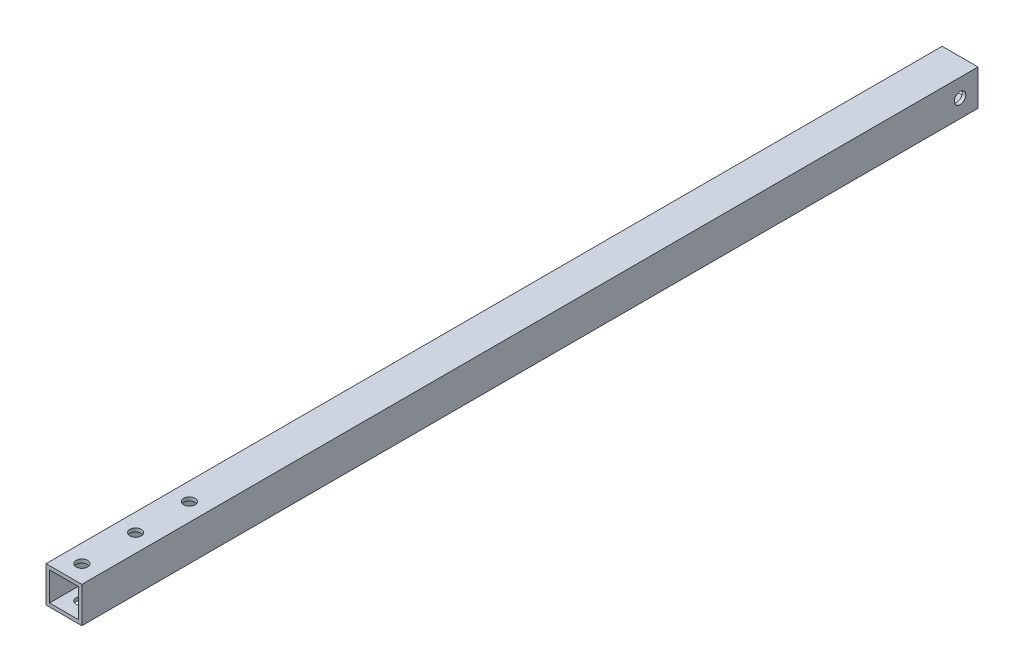
ISO-10303-21;
HEADER;
FILE_DESCRIPTION(('STEP AP214'),'2;1');
FILE_NAME('part.step','',(''),(''),'','','');
FILE_SCHEMA(('AUTOMOTIVE_DESIGN { 1 0 10303 214 1 1 1 1 }'));
ENDSEC;
DATA;
#1=APPLICATION_CONTEXT('core data for automotive mechanical design processes');
#2=APPLICATION_PROTOCOL_DEFINITION('international standard','automotive_design',2000,#1);
#3=PRODUCT_CONTEXT('',#1,'mechanical');
#4=PRODUCT('Part','Part','',(#3));
#5=PRODUCT_RELATED_PRODUCT_CATEGORY('part','',(#4));
#6=PRODUCT_DEFINITION_FORMATION('','',#4);
#7=PRODUCT_DEFINITION_CONTEXT('part definition',#1,'design');
#8=PRODUCT_DEFINITION('design','',#6,#7);
#9=PRODUCT_DEFINITION_SHAPE('','',#8);
#10=(LENGTH_UNIT() NAMED_UNIT(*) SI_UNIT(.MILLI.,.METRE.));
#11=(NAMED_UNIT(*) PLANE_ANGLE_UNIT() SI_UNIT($,.RADIAN.));
#12=(NAMED_UNIT(*) SI_UNIT($,.STERADIAN.) SOLID_ANGLE_UNIT());
#13=UNCERTAINTY_MEASURE_WITH_UNIT(LENGTH_MEASURE(1.E-05),#10,'distance_accuracy_value','');
#14=(GEOMETRIC_REPRESENTATION_CONTEXT(3) GLOBAL_UNCERTAINTY_ASSIGNED_CONTEXT((#13)) GLOBAL_UNIT_ASSIGNED_CONTEXT((#10,
#11,#12)) REPRESENTATION_CONTEXT('',''));
#15=CARTESIAN_POINT('',(0.,0.,0.));
#16=DIRECTION('',(0.,0.,1.));
#17=DIRECTION('',(1.,0.,0.));
#18=AXIS2_PLACEMENT_3D('',#15,#16,#17);
#19=CARTESIAN_POINT('',(0.,0.,250.));
#20=DIRECTION('',(0.,0.,1.));
#21=DIRECTION('',(1.,0.,0.));
#22=AXIS2_PLACEMENT_3D('',#19,#20,#21);
#23=PLANE('',#22);
#24=DIRECTION('',(0.,-1.,0.));
#25=VECTOR('',#24,1.);
#26=CARTESIAN_POINT('',(-5.,-5.,250.));
#27=LINE('',#26,#25);
#28=CARTESIAN_POINT('',(-5.,5.,250.));
#29=VERTEX_POINT('',#28);
#30=CARTESIAN_POINT('',(-5.,-5.,250.));
#31=VERTEX_POINT('',#30);
#32=EDGE_CURVE('E138',#29,#31,#27,.T.);
#33=ORIENTED_EDGE('',*,*,#32,.T.);
#34=DIRECTION('',(1.,0.,0.));
#35=VECTOR('',#34,1.);
#36=CARTESIAN_POINT('',(5.,-5.,250.));
#37=LINE('',#36,#35);
#38=CARTESIAN_POINT('',(5.,-5.,250.));
#39=VERTEX_POINT('',#38);
#40=EDGE_CURVE('E141',#31,#39,#37,.T.);
#41=ORIENTED_EDGE('',*,*,#40,.T.);
#42=DIRECTION('',(0.,1.,0.));
#43=VECTOR('',#42,1.);
#44=CARTESIAN_POINT('',(5.,-5.,250.));
#45=LINE('',#44,#43);
#46=CARTESIAN_POINT('',(5.,5.,250.));
#47=VERTEX_POINT('',#46);
#48=EDGE_CURVE('E144',#39,#47,#45,.T.);
#49=ORIENTED_EDGE('',*,*,#48,.T.);
#50=DIRECTION('',(-1.,0.,0.));
#51=VECTOR('',#50,1.);
#52=CARTESIAN_POINT('',(5.,5.,250.));
#53=LINE('',#52,#51);
#54=EDGE_CURVE('E146',#47,#29,#53,.T.);
#55=ORIENTED_EDGE('',*,*,#54,.T.);
#56=EDGE_LOOP('',(#33,#41,#49,#55));
#57=FACE_BOUND('',#56,.T.);
#58=DIRECTION('',(1.,0.,0.));
#59=VECTOR('',#58,1.);
#60=CARTESIAN_POINT('',(4.,-4.,250.));
#61=LINE('',#60,#59);
#62=CARTESIAN_POINT('',(-4.,-4.,250.));
#63=VERTEX_POINT('',#62);
#64=CARTESIAN_POINT('',(4.,-4.,250.));
#65=VERTEX_POINT('',#64);
#66=EDGE_CURVE('E108',#63,#65,#61,.T.);
#67=ORIENTED_EDGE('',*,*,#66,.F.);
#68=DIRECTION('',(0.,-1.,0.));
#69=VECTOR('',#68,1.);
#70=CARTESIAN_POINT('',(-4.,-4.,250.));
#71=LINE('',#70,#69);
#72=CARTESIAN_POINT('',(-4.,4.,250.));
#73=VERTEX_POINT('',#72);
#74=EDGE_CURVE('E100',#73,#63,#71,.T.);
#75=ORIENTED_EDGE('',*,*,#74,.F.);
#76=DIRECTION('',(-1.,0.,0.));
#77=VECTOR('',#76,1.);
#78=CARTESIAN_POINT('',(4.,4.,250.));
#79=LINE('',#78,#77);
#80=CARTESIAN_POINT('',(4.,4.,250.));
#81=VERTEX_POINT('',#80);
#82=EDGE_CURVE('E122',#81,#73,#79,.T.);
#83=ORIENTED_EDGE('',*,*,#82,.F.);
#84=DIRECTION('',(0.,1.,0.));
#85=VECTOR('',#84,1.);
#86=CARTESIAN_POINT('',(4.,-4.,250.));
#87=LINE('',#86,#85);
#88=EDGE_CURVE('E120',#65,#81,#87,.T.);
#89=ORIENTED_EDGE('',*,*,#88,.F.);
#90=EDGE_LOOP('',(#67,#75,#83,#89));
#91=FACE_BOUND('',#90,.T.);
#92=ADVANCED_FACE('F33',(#57,#91),#23,.T.);
#93=CARTESIAN_POINT('',(0.,0.,0.));
#94=DIRECTION('',(0.,0.,1.));
#95=DIRECTION('',(1.,0.,0.));
#96=AXIS2_PLACEMENT_3D('',#93,#94,#95);
#97=PLANE('',#96);
#98=DIRECTION('',(0.,-1.,0.));
#99=VECTOR('',#98,1.);
#100=CARTESIAN_POINT('',(-5.,-5.,0.));
#101=LINE('',#100,#99);
#102=CARTESIAN_POINT('',(-5.,5.,0.));
#103=VERTEX_POINT('',#102);
#104=CARTESIAN_POINT('',(-5.,-5.,0.));
#105=VERTEX_POINT('',#104);
#106=EDGE_CURVE('E116',#103,#105,#101,.T.);
#107=ORIENTED_EDGE('',*,*,#106,.F.);
#108=DIRECTION('',(-1.,0.,0.));
#109=VECTOR('',#108,1.);
#110=CARTESIAN_POINT('',(5.,5.,0.));
#111=LINE('',#110,#109);
#112=CARTESIAN_POINT('',(5.,5.,0.));
#113=VERTEX_POINT('',#112);
#114=EDGE_CURVE('E142',#113,#103,#111,.T.);
#115=ORIENTED_EDGE('',*,*,#114,.F.);
#116=DIRECTION('',(0.,1.,0.));
#117=VECTOR('',#116,1.);
#118=CARTESIAN_POINT('',(5.,-5.,0.));
#119=LINE('',#118,#117);
#120=CARTESIAN_POINT('',(5.,-5.,0.));
#121=VERTEX_POINT('',#120);
#122=EDGE_CURVE('E153',#121,#113,#119,.T.);
#123=ORIENTED_EDGE('',*,*,#122,.F.);
#124=DIRECTION('',(1.,0.,0.));
#125=VECTOR('',#124,1.);
#126=CARTESIAN_POINT('',(5.,-5.,0.));
#127=LINE('',#126,#125);
#128=EDGE_CURVE('E151',#105,#121,#127,.T.);
#129=ORIENTED_EDGE('',*,*,#128,.F.);
#130=EDGE_LOOP('',(#107,#115,#123,#129));
#131=FACE_BOUND('',#130,.T.);
#132=DIRECTION('',(0.,-1.,0.));
#133=VECTOR('',#132,1.);
#134=CARTESIAN_POINT('',(-4.,-4.,0.));
#135=LINE('',#134,#133);
#136=CARTESIAN_POINT('',(-4.,4.,0.));
#137=VERTEX_POINT('',#136);
#138=CARTESIAN_POINT('',(-4.,-4.,0.));
#139=VERTEX_POINT('',#138);
#140=EDGE_CURVE('E58',#137,#139,#135,.T.);
#141=ORIENTED_EDGE('',*,*,#140,.T.);
#142=DIRECTION('',(1.,0.,0.));
#143=VECTOR('',#142,1.);
#144=CARTESIAN_POINT('',(4.,-4.,0.));
#145=LINE('',#144,#143);
#146=CARTESIAN_POINT('',(4.,-4.,0.));
#147=VERTEX_POINT('',#146);
#148=EDGE_CURVE('E115',#139,#147,#145,.T.);
#149=ORIENTED_EDGE('',*,*,#148,.T.);
#150=DIRECTION('',(0.,1.,0.));
#151=VECTOR('',#150,1.);
#152=CARTESIAN_POINT('',(4.,-4.,0.));
#153=LINE('',#152,#151);
#154=CARTESIAN_POINT('',(4.,4.,0.));
#155=VERTEX_POINT('',#154);
#156=EDGE_CURVE('E130',#147,#155,#153,.T.);
#157=ORIENTED_EDGE('',*,*,#156,.T.);
#158=DIRECTION('',(-1.,0.,0.));
#159=VECTOR('',#158,1.);
#160=CARTESIAN_POINT('',(4.,4.,0.));
#161=LINE('',#160,#159);
#162=EDGE_CURVE('E109',#155,#137,#161,.T.);
#163=ORIENTED_EDGE('',*,*,#162,.T.);
#164=EDGE_LOOP('',(#141,#149,#157,#163));
#165=FACE_BOUND('',#164,.T.);
#166=ADVANCED_FACE('F222',(#131,#165),#97,.F.);
#167=CARTESIAN_POINT('',(-5.,-5.,250.));
#168=DIRECTION('',(1.,0.,0.));
#169=DIRECTION('',(0.,0.,-1.));
#170=AXIS2_PLACEMENT_3D('',#167,#168,#169);
#171=PLANE('',#170);
#172=CARTESIAN_POINT('',(-5.,0.,5.));
#173=DIRECTION('',(1.,0.,0.));
#174=DIRECTION('',(0.,0.,-1.));
#175=AXIS2_PLACEMENT_3D('',#172,#173,#174);
#176=CIRCLE('',#175,1.6);
#177=CARTESIAN_POINT('',(-5.,0.,3.4));
#178=VERTEX_POINT('',#177);
#179=EDGE_CURVE('E187',#178,#178,#176,.T.);
#180=ORIENTED_EDGE('',*,*,#179,.T.);
#181=EDGE_LOOP('',(#180));
#182=FACE_BOUND('',#181,.T.);
#183=ORIENTED_EDGE('',*,*,#106,.T.);
#184=DIRECTION('',(0.,0.,-1.));
#185=VECTOR('',#184,1.);
#186=CARTESIAN_POINT('',(-5.,-5.,250.));
#187=LINE('',#186,#185);
#188=EDGE_CURVE('E11',#31,#105,#187,.T.);
#189=ORIENTED_EDGE('',*,*,#188,.F.);
#190=ORIENTED_EDGE('',*,*,#32,.F.);
#191=DIRECTION('',(0.,0.,-1.));
#192=VECTOR('',#191,1.);
#193=CARTESIAN_POINT('',(-5.,5.,250.));
#194=LINE('',#193,#192);
#195=EDGE_CURVE('E148',#29,#103,#194,.T.);
#196=ORIENTED_EDGE('',*,*,#195,.T.);
#197=EDGE_LOOP('',(#183,#189,#190,#196));
#198=FACE_BOUND('',#197,.T.);
#199=ADVANCED_FACE('F35',(#182,#198),#171,.F.);
#200=CARTESIAN_POINT('',(5.,-5.,250.));
#201=DIRECTION('',(0.,1.,0.));
#202=DIRECTION('',(0.,0.,1.));
#203=AXIS2_PLACEMENT_3D('',#200,#201,#202);
#204=PLANE('',#203);
#205=CARTESIAN_POINT('',(0.,-5.,215.));
#206=DIRECTION('',(0.,1.,0.));
#207=DIRECTION('',(-1.,0.,0.));
#208=AXIS2_PLACEMENT_3D('',#205,#206,#207);
#209=CIRCLE('',#208,1.59999999999999);
#210=CARTESIAN_POINT('',(-1.59999999999999,-5.,215.));
#211=VERTEX_POINT('',#210);
#212=EDGE_CURVE('E167',#211,#211,#209,.T.);
#213=ORIENTED_EDGE('',*,*,#212,.T.);
#214=EDGE_LOOP('',(#213));
#215=FACE_BOUND('',#214,.T.);
#216=CARTESIAN_POINT('',(0.,-5.,245.));
#217=DIRECTION('',(0.,1.,0.));
#218=DIRECTION('',(-1.,0.,0.));
#219=AXIS2_PLACEMENT_3D('',#216,#217,#218);
#220=CIRCLE('',#219,1.6);
#221=CARTESIAN_POINT('',(-1.6,-5.,245.));
#222=VERTEX_POINT('',#221);
#223=EDGE_CURVE('E193',#222,#222,#220,.T.);
#224=ORIENTED_EDGE('',*,*,#223,.T.);
#225=EDGE_LOOP('',(#224));
#226=FACE_BOUND('',#225,.T.);
#227=CARTESIAN_POINT('',(0.,-5.,230.));
#228=DIRECTION('',(0.,1.,0.));
#229=DIRECTION('',(-1.,0.,0.));
#230=AXIS2_PLACEMENT_3D('',#227,#228,#229);
#231=CIRCLE('',#230,1.59999999999999);
#232=CARTESIAN_POINT('',(-1.59999999999999,-5.,230.));
#233=VERTEX_POINT('',#232);
#234=EDGE_CURVE('E186',#233,#233,#231,.T.);
#235=ORIENTED_EDGE('',*,*,#234,.T.);
#236=EDGE_LOOP('',(#235));
#237=FACE_BOUND('',#236,.T.);
#238=ORIENTED_EDGE('',*,*,#128,.T.);
#239=DIRECTION('',(0.,0.,-1.));
#240=VECTOR('',#239,1.);
#241=CARTESIAN_POINT('',(5.,-5.,250.));
#242=LINE('',#241,#240);
#243=EDGE_CURVE('E42',#39,#121,#242,.T.);
#244=ORIENTED_EDGE('',*,*,#243,.F.);
#245=ORIENTED_EDGE('',*,*,#40,.F.);
#246=ORIENTED_EDGE('',*,*,#188,.T.);
#247=EDGE_LOOP('',(#238,#244,#245,#246));
#248=FACE_BOUND('',#247,.T.);
#249=ADVANCED_FACE('F252',(#215,#226,#237,#248),#204,.F.);
#250=CARTESIAN_POINT('',(5.,-5.,250.));
#251=DIRECTION('',(-1.,0.,0.));
#252=DIRECTION('',(0.,0.,1.));
#253=AXIS2_PLACEMENT_3D('',#250,#251,#252);
#254=PLANE('',#253);
#255=CARTESIAN_POINT('',(5.,0.,5.));
#256=DIRECTION('',(1.,0.,0.));
#257=DIRECTION('',(0.,0.,-1.));
#258=AXIS2_PLACEMENT_3D('',#255,#256,#257);
#259=CIRCLE('',#258,1.6);
#260=CARTESIAN_POINT('',(5.,0.,3.4));
#261=VERTEX_POINT('',#260);
#262=EDGE_CURVE('E206',#261,#261,#259,.T.);
#263=ORIENTED_EDGE('',*,*,#262,.F.);
#264=EDGE_LOOP('',(#263));
#265=FACE_BOUND('',#264,.T.);
#266=ORIENTED_EDGE('',*,*,#122,.T.);
#267=DIRECTION('',(0.,0.,-1.));
#268=VECTOR('',#267,1.);
#269=CARTESIAN_POINT('',(5.,5.,250.));
#270=LINE('',#269,#268);
#271=EDGE_CURVE('E158',#47,#113,#270,.T.);
#272=ORIENTED_EDGE('',*,*,#271,.F.);
#273=ORIENTED_EDGE('',*,*,#48,.F.);
#274=ORIENTED_EDGE('',*,*,#243,.T.);
#275=EDGE_LOOP('',(#266,#272,#273,#274));
#276=FACE_BOUND('',#275,.T.);
#277=ADVANCED_FACE('F249',(#265,#276),#254,.F.);
#278=CARTESIAN_POINT('',(5.,5.,250.));
#279=DIRECTION('',(0.,-1.,0.));
#280=DIRECTION('',(1.,0.,0.));
#281=AXIS2_PLACEMENT_3D('',#278,#279,#280);
#282=PLANE('',#281);
#283=CARTESIAN_POINT('',(0.,5.,215.));
#284=DIRECTION('',(0.,1.,0.));
#285=DIRECTION('',(-1.,0.,0.));
#286=AXIS2_PLACEMENT_3D('',#283,#284,#285);
#287=CIRCLE('',#286,1.59999999999999);
#288=CARTESIAN_POINT('',(-1.59999999999999,5.,215.));
#289=VERTEX_POINT('',#288);
#290=EDGE_CURVE('E196',#289,#289,#287,.T.);
#291=ORIENTED_EDGE('',*,*,#290,.F.);
#292=EDGE_LOOP('',(#291));
#293=FACE_BOUND('',#292,.T.);
#294=CARTESIAN_POINT('',(0.,5.,245.));
#295=DIRECTION('',(0.,1.,0.));
#296=DIRECTION('',(-1.,0.,0.));
#297=AXIS2_PLACEMENT_3D('',#294,#295,#296);
#298=CIRCLE('',#297,1.6);
#299=CARTESIAN_POINT('',(-1.6,5.,245.));
#300=VERTEX_POINT('',#299);
#301=EDGE_CURVE('E190',#300,#300,#298,.T.);
#302=ORIENTED_EDGE('',*,*,#301,.F.);
#303=EDGE_LOOP('',(#302));
#304=FACE_BOUND('',#303,.T.);
#305=CARTESIAN_POINT('',(0.,5.,230.));
#306=DIRECTION('',(0.,1.,0.));
#307=DIRECTION('',(-1.,0.,0.));
#308=AXIS2_PLACEMENT_3D('',#305,#306,#307);
#309=CIRCLE('',#308,1.59999999999999);
#310=CARTESIAN_POINT('',(-1.59999999999999,5.,230.));
#311=VERTEX_POINT('',#310);
#312=EDGE_CURVE('E183',#311,#311,#309,.T.);
#313=ORIENTED_EDGE('',*,*,#312,.F.);
#314=EDGE_LOOP('',(#313));
#315=FACE_BOUND('',#314,.T.);
#316=ORIENTED_EDGE('',*,*,#114,.T.);
#317=ORIENTED_EDGE('',*,*,#195,.F.);
#318=ORIENTED_EDGE('',*,*,#54,.F.);
#319=ORIENTED_EDGE('',*,*,#271,.T.);
#320=EDGE_LOOP('',(#316,#317,#318,#319));
#321=FACE_BOUND('',#320,.T.);
#322=ADVANCED_FACE('F246',(#293,#304,#315,#321),#282,.F.);
#323=CARTESIAN_POINT('',(-4.,-4.,250.));
#324=DIRECTION('',(1.,0.,0.));
#325=DIRECTION('',(0.,0.,-1.));
#326=AXIS2_PLACEMENT_3D('',#323,#324,#325);
#327=PLANE('',#326);
#328=CARTESIAN_POINT('',(-4.,0.,5.));
#329=DIRECTION('',(1.,0.,0.));
#330=DIRECTION('',(0.,0.,-1.));
#331=AXIS2_PLACEMENT_3D('',#328,#329,#330);
#332=CIRCLE('',#331,1.6);
#333=CARTESIAN_POINT('',(-4.,0.,3.4));
#334=VERTEX_POINT('',#333);
#335=EDGE_CURVE('E203',#334,#334,#332,.T.);
#336=ORIENTED_EDGE('',*,*,#335,.F.);
#337=EDGE_LOOP('',(#336));
#338=FACE_BOUND('',#337,.T.);
#339=ORIENTED_EDGE('',*,*,#140,.F.);
#340=DIRECTION('',(0.,0.,-1.));
#341=VECTOR('',#340,1.);
#342=CARTESIAN_POINT('',(-4.,4.,250.));
#343=LINE('',#342,#341);
#344=EDGE_CURVE('E104',#73,#137,#343,.T.);
#345=ORIENTED_EDGE('',*,*,#344,.F.);
#346=ORIENTED_EDGE('',*,*,#74,.T.);
#347=DIRECTION('',(0.,0.,-1.));
#348=VECTOR('',#347,1.);
#349=CARTESIAN_POINT('',(-4.,-4.,250.));
#350=LINE('',#349,#348);
#351=EDGE_CURVE('E103',#63,#139,#350,.T.);
#352=ORIENTED_EDGE('',*,*,#351,.T.);
#353=EDGE_LOOP('',(#339,#345,#346,#352));
#354=FACE_BOUND('',#353,.T.);
#355=ADVANCED_FACE('F102',(#338,#354),#327,.T.);
#356=CARTESIAN_POINT('',(4.,-4.,250.));
#357=DIRECTION('',(0.,1.,0.));
#358=DIRECTION('',(0.,0.,1.));
#359=AXIS2_PLACEMENT_3D('',#356,#357,#358);
#360=PLANE('',#359);
#361=CARTESIAN_POINT('',(0.,-4.,215.));
#362=DIRECTION('',(0.,1.,0.));
#363=DIRECTION('',(0.,0.,1.));
#364=AXIS2_PLACEMENT_3D('',#361,#362,#363);
#365=CIRCLE('',#364,1.59999999999999);
#366=CARTESIAN_POINT('',(0.,-4.,216.6));
#367=VERTEX_POINT('',#366);
#368=EDGE_CURVE('E128',#367,#367,#365,.T.);
#369=ORIENTED_EDGE('',*,*,#368,.F.);
#370=EDGE_LOOP('',(#369));
#371=FACE_BOUND('',#370,.T.);
#372=CARTESIAN_POINT('',(0.,-4.,245.));
#373=DIRECTION('',(0.,1.,0.));
#374=DIRECTION('',(0.,0.,1.));
#375=AXIS2_PLACEMENT_3D('',#372,#373,#374);
#376=CIRCLE('',#375,1.6);
#377=CARTESIAN_POINT('',(0.,-4.,246.6));
#378=VERTEX_POINT('',#377);
#379=EDGE_CURVE('E170',#378,#378,#376,.T.);
#380=ORIENTED_EDGE('',*,*,#379,.F.);
#381=EDGE_LOOP('',(#380));
#382=FACE_BOUND('',#381,.T.);
#383=CARTESIAN_POINT('',(0.,-4.,230.));
#384=DIRECTION('',(0.,1.,0.));
#385=DIRECTION('',(0.,0.,1.));
#386=AXIS2_PLACEMENT_3D('',#383,#384,#385);
#387=CIRCLE('',#386,1.59999999999999);
#388=CARTESIAN_POINT('',(0.,-4.,231.6));
#389=VERTEX_POINT('',#388);
#390=EDGE_CURVE('E166',#389,#389,#387,.T.);
#391=ORIENTED_EDGE('',*,*,#390,.F.);
#392=EDGE_LOOP('',(#391));
#393=FACE_BOUND('',#392,.T.);
#394=ORIENTED_EDGE('',*,*,#148,.F.);
#395=ORIENTED_EDGE('',*,*,#351,.F.);
#396=ORIENTED_EDGE('',*,*,#66,.T.);
#397=DIRECTION('',(0.,0.,-1.));
#398=VECTOR('',#397,1.);
#399=CARTESIAN_POINT('',(4.,-4.,250.));
#400=LINE('',#399,#398);
#401=EDGE_CURVE('E117',#65,#147,#400,.T.);
#402=ORIENTED_EDGE('',*,*,#401,.T.);
#403=EDGE_LOOP('',(#394,#395,#396,#402));
#404=FACE_BOUND('',#403,.T.);
#405=ADVANCED_FACE('F112',(#371,#382,#393,#404),#360,.T.);
#406=CARTESIAN_POINT('',(4.,-4.,250.));
#407=DIRECTION('',(-1.,0.,0.));
#408=DIRECTION('',(0.,0.,1.));
#409=AXIS2_PLACEMENT_3D('',#406,#407,#408);
#410=PLANE('',#409);
#411=CARTESIAN_POINT('',(4.,0.,5.));
#412=DIRECTION('',(-1.,0.,0.));
#413=DIRECTION('',(0.,0.,1.));
#414=AXIS2_PLACEMENT_3D('',#411,#412,#413);
#415=CIRCLE('',#414,1.6);
#416=CARTESIAN_POINT('',(4.,0.,6.6));
#417=VERTEX_POINT('',#416);
#418=EDGE_CURVE('E37',#417,#417,#415,.T.);
#419=ORIENTED_EDGE('',*,*,#418,.F.);
#420=EDGE_LOOP('',(#419));
#421=FACE_BOUND('',#420,.T.);
#422=ORIENTED_EDGE('',*,*,#156,.F.);
#423=ORIENTED_EDGE('',*,*,#401,.F.);
#424=ORIENTED_EDGE('',*,*,#88,.T.);
#425=DIRECTION('',(0.,0.,-1.));
#426=VECTOR('',#425,1.);
#427=CARTESIAN_POINT('',(4.,4.,250.));
#428=LINE('',#427,#426);
#429=EDGE_CURVE('E50',#81,#155,#428,.T.);
#430=ORIENTED_EDGE('',*,*,#429,.T.);
#431=EDGE_LOOP('',(#422,#423,#424,#430));
#432=FACE_BOUND('',#431,.T.);
#433=ADVANCED_FACE('F215',(#421,#432),#410,.T.);
#434=CARTESIAN_POINT('',(4.,4.,250.));
#435=DIRECTION('',(0.,-1.,0.));
#436=DIRECTION('',(0.,0.,-1.));
#437=AXIS2_PLACEMENT_3D('',#434,#435,#436);
#438=PLANE('',#437);
#439=CARTESIAN_POINT('',(0.,4.,215.));
#440=DIRECTION('',(0.,-1.,0.));
#441=DIRECTION('',(0.,0.,-1.));
#442=AXIS2_PLACEMENT_3D('',#439,#440,#441);
#443=CIRCLE('',#442,1.59999999999999);
#444=CARTESIAN_POINT('',(0.,4.,213.4));
#445=VERTEX_POINT('',#444);
#446=EDGE_CURVE('E171',#445,#445,#443,.T.);
#447=ORIENTED_EDGE('',*,*,#446,.F.);
#448=EDGE_LOOP('',(#447));
#449=FACE_BOUND('',#448,.T.);
#450=CARTESIAN_POINT('',(0.,4.,245.));
#451=DIRECTION('',(0.,-1.,0.));
#452=DIRECTION('',(0.,0.,-1.));
#453=AXIS2_PLACEMENT_3D('',#450,#451,#452);
#454=CIRCLE('',#453,1.6);
#455=CARTESIAN_POINT('',(0.,4.,243.4));
#456=VERTEX_POINT('',#455);
#457=EDGE_CURVE('E168',#456,#456,#454,.T.);
#458=ORIENTED_EDGE('',*,*,#457,.F.);
#459=EDGE_LOOP('',(#458));
#460=FACE_BOUND('',#459,.T.);
#461=CARTESIAN_POINT('',(0.,4.,230.));
#462=DIRECTION('',(0.,-1.,0.));
#463=DIRECTION('',(0.,0.,-1.));
#464=AXIS2_PLACEMENT_3D('',#461,#462,#463);
#465=CIRCLE('',#464,1.59999999999999);
#466=CARTESIAN_POINT('',(0.,4.,228.4));
#467=VERTEX_POINT('',#466);
#468=EDGE_CURVE('E163',#467,#467,#465,.T.);
#469=ORIENTED_EDGE('',*,*,#468,.F.);
#470=EDGE_LOOP('',(#469));
#471=FACE_BOUND('',#470,.T.);
#472=ORIENTED_EDGE('',*,*,#162,.F.);
#473=ORIENTED_EDGE('',*,*,#429,.F.);
#474=ORIENTED_EDGE('',*,*,#82,.T.);
#475=ORIENTED_EDGE('',*,*,#344,.T.);
#476=EDGE_LOOP('',(#472,#473,#474,#475));
#477=FACE_BOUND('',#476,.T.);
#478=ADVANCED_FACE('F218',(#449,#460,#471,#477),#438,.T.);
#479=CARTESIAN_POINT('',(0.,-5.,230.));
#480=DIRECTION('',(0.,1.,0.));
#481=DIRECTION('',(-1.,0.,0.));
#482=AXIS2_PLACEMENT_3D('',#479,#480,#481);
#483=CYLINDRICAL_SURFACE('',#482,1.59999999999999);
#484=ORIENTED_EDGE('',*,*,#468,.T.);
#485=EDGE_LOOP('',(#484));
#486=FACE_BOUND('',#485,.T.);
#487=ORIENTED_EDGE('',*,*,#312,.T.);
#488=EDGE_LOOP('',(#487));
#489=FACE_BOUND('',#488,.T.);
#490=ADVANCED_FACE('F224',(#486,#489),#483,.F.);
#491=CARTESIAN_POINT('',(0.,-5.,245.));
#492=DIRECTION('',(0.,1.,0.));
#493=DIRECTION('',(-1.,0.,0.));
#494=AXIS2_PLACEMENT_3D('',#491,#492,#493);
#495=CYLINDRICAL_SURFACE('',#494,1.6);
#496=ORIENTED_EDGE('',*,*,#457,.T.);
#497=EDGE_LOOP('',(#496));
#498=FACE_BOUND('',#497,.T.);
#499=ORIENTED_EDGE('',*,*,#301,.T.);
#500=EDGE_LOOP('',(#499));
#501=FACE_BOUND('',#500,.T.);
#502=ADVANCED_FACE('F230',(#498,#501),#495,.F.);
#503=CARTESIAN_POINT('',(0.,-5.,215.));
#504=DIRECTION('',(0.,1.,0.));
#505=DIRECTION('',(-1.,0.,0.));
#506=AXIS2_PLACEMENT_3D('',#503,#504,#505);
#507=CYLINDRICAL_SURFACE('',#506,1.59999999999999);
#508=ORIENTED_EDGE('',*,*,#446,.T.);
#509=EDGE_LOOP('',(#508));
#510=FACE_BOUND('',#509,.T.);
#511=ORIENTED_EDGE('',*,*,#290,.T.);
#512=EDGE_LOOP('',(#511));
#513=FACE_BOUND('',#512,.T.);
#514=ADVANCED_FACE('F282',(#510,#513),#507,.F.);
#515=ORIENTED_EDGE('',*,*,#390,.T.);
#516=EDGE_LOOP('',(#515));
#517=FACE_BOUND('',#516,.T.);
#518=ORIENTED_EDGE('',*,*,#234,.F.);
#519=EDGE_LOOP('',(#518));
#520=FACE_BOUND('',#519,.T.);
#521=ADVANCED_FACE('F233',(#517,#520),#483,.F.);
#522=ORIENTED_EDGE('',*,*,#379,.T.);
#523=EDGE_LOOP('',(#522));
#524=FACE_BOUND('',#523,.T.);
#525=ORIENTED_EDGE('',*,*,#223,.F.);
#526=EDGE_LOOP('',(#525));
#527=FACE_BOUND('',#526,.T.);
#528=ADVANCED_FACE('F281',(#524,#527),#495,.F.);
#529=ORIENTED_EDGE('',*,*,#368,.T.);
#530=EDGE_LOOP('',(#529));
#531=FACE_BOUND('',#530,.T.);
#532=ORIENTED_EDGE('',*,*,#212,.F.);
#533=EDGE_LOOP('',(#532));
#534=FACE_BOUND('',#533,.T.);
#535=ADVANCED_FACE('F288',(#531,#534),#507,.F.);
#536=CARTESIAN_POINT('',(-55.,0.,5.));
#537=DIRECTION('',(1.,0.,0.));
#538=DIRECTION('',(0.,0.,-1.));
#539=AXIS2_PLACEMENT_3D('',#536,#537,#538);
#540=CYLINDRICAL_SURFACE('',#539,1.6);
#541=ORIENTED_EDGE('',*,*,#418,.T.);
#542=EDGE_LOOP('',(#541));
#543=FACE_BOUND('',#542,.T.);
#544=ORIENTED_EDGE('',*,*,#262,.T.);
#545=EDGE_LOOP('',(#544));
#546=FACE_BOUND('',#545,.T.);
#547=ADVANCED_FACE('F213',(#543,#546),#540,.F.);
#548=ORIENTED_EDGE('',*,*,#335,.T.);
#549=EDGE_LOOP('',(#548));
#550=FACE_BOUND('',#549,.T.);
#551=ORIENTED_EDGE('',*,*,#179,.F.);
#552=EDGE_LOOP('',(#551));
#553=FACE_BOUND('',#552,.T.);
#554=ADVANCED_FACE('F295',(#550,#553),#540,.F.);
#555=CLOSED_SHELL('',(#92,#166,#199,#249,#277,#322,#355,#405,#433,#478,#490,#502,#514,#521,#528,
#535,#547,#554));
#556=MANIFOLD_SOLID_BREP('B2',#555);
#557=ADVANCED_BREP_SHAPE_REPRESENTATION('',(#18,#556),#14);
#558=SHAPE_DEFINITION_REPRESENTATION(#9,#557);
ENDSEC;
END-ISO-10303-21;
